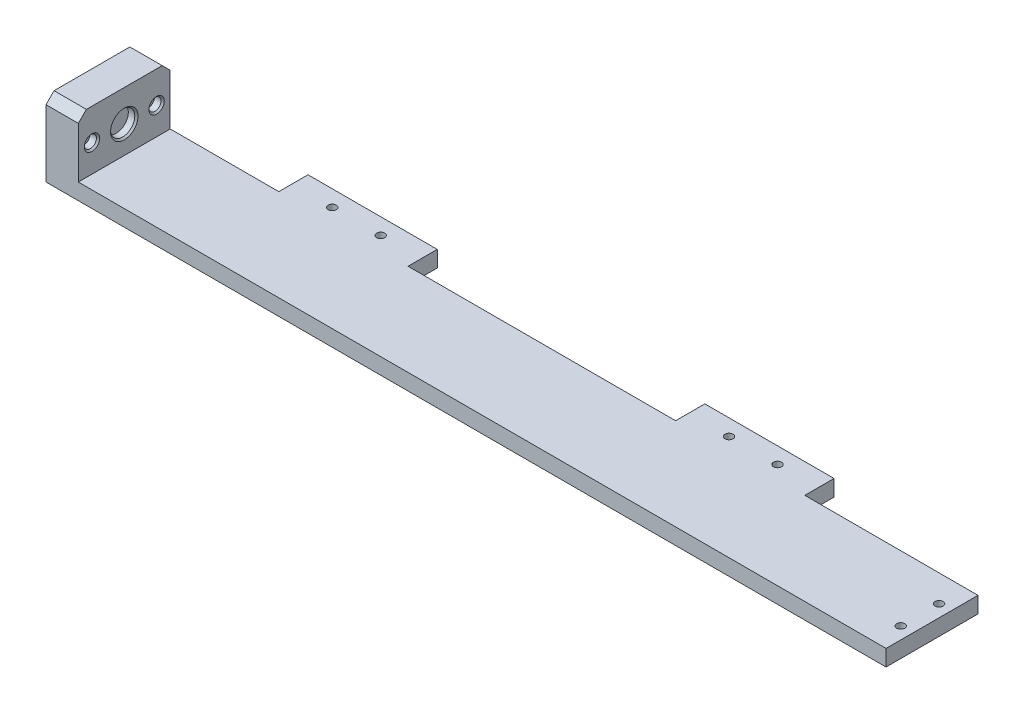
ISO-10303-21;
HEADER;
FILE_DESCRIPTION(('STEP AP214'),'2;1');
FILE_NAME('part.step','',(''),(''),'','','');
FILE_SCHEMA(('AUTOMOTIVE_DESIGN { 1 0 10303 214 1 1 1 1 }'));
ENDSEC;
DATA;
#1=APPLICATION_CONTEXT('core data for automotive mechanical design processes');
#2=APPLICATION_PROTOCOL_DEFINITION('international standard','automotive_design',2000,#1);
#3=PRODUCT_CONTEXT('',#1,'mechanical');
#4=PRODUCT('Part','Part','',(#3));
#5=PRODUCT_RELATED_PRODUCT_CATEGORY('part','',(#4));
#6=PRODUCT_DEFINITION_FORMATION('','',#4);
#7=PRODUCT_DEFINITION_CONTEXT('part definition',#1,'design');
#8=PRODUCT_DEFINITION('design','',#6,#7);
#9=PRODUCT_DEFINITION_SHAPE('','',#8);
#10=(LENGTH_UNIT() NAMED_UNIT(*) SI_UNIT(.MILLI.,.METRE.));
#11=(NAMED_UNIT(*) PLANE_ANGLE_UNIT() SI_UNIT($,.RADIAN.));
#12=(NAMED_UNIT(*) SI_UNIT($,.STERADIAN.) SOLID_ANGLE_UNIT());
#13=UNCERTAINTY_MEASURE_WITH_UNIT(LENGTH_MEASURE(1.E-05),#10,'distance_accuracy_value','');
#14=(GEOMETRIC_REPRESENTATION_CONTEXT(3) GLOBAL_UNCERTAINTY_ASSIGNED_CONTEXT((#13)) GLOBAL_UNIT_ASSIGNED_CONTEXT((#10,
#11,#12)) REPRESENTATION_CONTEXT('',''));
#15=CARTESIAN_POINT('',(0.,0.,0.));
#16=DIRECTION('',(0.,0.,1.));
#17=DIRECTION('',(1.,0.,0.));
#18=AXIS2_PLACEMENT_3D('',#15,#16,#17);
#19=CARTESIAN_POINT('',(0.,20.,0.));
#20=DIRECTION('',(0.,1.,0.));
#21=DIRECTION('',(0.,0.,1.));
#22=AXIS2_PLACEMENT_3D('',#19,#20,#21);
#23=PLANE('',#22);
#24=CARTESIAN_POINT('',(-275.625,20.,-73.0910485052595));
#25=DIRECTION('',(0.,1.,0.));
#26=DIRECTION('',(0.,0.,1.));
#27=AXIS2_PLACEMENT_3D('',#24,#25,#26);
#28=CIRCLE('',#27,4.99999999999999);
#29=CARTESIAN_POINT('',(-275.625,20.,-68.0910485052595));
#30=VERTEX_POINT('',#29);
#31=EDGE_CURVE('E317',#30,#30,#28,.T.);
#32=ORIENTED_EDGE('',*,*,#31,.F.);
#33=EDGE_LOOP('',(#32));
#34=FACE_BOUND('',#33,.T.);
#35=CARTESIAN_POINT('',(-215.625,20.,-73.0910485052595));
#36=DIRECTION('',(0.,1.,0.));
#37=DIRECTION('',(0.,0.,1.));
#38=AXIS2_PLACEMENT_3D('',#35,#36,#37);
#39=CIRCLE('',#38,4.99999999999999);
#40=CARTESIAN_POINT('',(-215.625,20.,-68.0910485052595));
#41=VERTEX_POINT('',#40);
#42=EDGE_CURVE('E512',#41,#41,#39,.T.);
#43=ORIENTED_EDGE('',*,*,#42,.F.);
#44=EDGE_LOOP('',(#43));
#45=FACE_BOUND('',#44,.T.);
#46=CARTESIAN_POINT('',(215.625,20.,-73.0910485052595));
#47=DIRECTION('',(0.,1.,0.));
#48=DIRECTION('',(0.,0.,1.));
#49=AXIS2_PLACEMENT_3D('',#46,#47,#48);
#50=CIRCLE('',#49,4.99999999999999);
#51=CARTESIAN_POINT('',(215.625,20.,-68.0910485052595));
#52=VERTEX_POINT('',#51);
#53=EDGE_CURVE('E515',#52,#52,#50,.T.);
#54=ORIENTED_EDGE('',*,*,#53,.F.);
#55=EDGE_LOOP('',(#54));
#56=FACE_BOUND('',#55,.T.);
#57=CARTESIAN_POINT('',(275.625,20.,-73.0910485052595));
#58=DIRECTION('',(0.,1.,0.));
#59=DIRECTION('',(0.,0.,1.));
#60=AXIS2_PLACEMENT_3D('',#57,#58,#59);
#61=CIRCLE('',#60,4.99999999999999);
#62=CARTESIAN_POINT('',(275.625,20.,-68.0910485052595));
#63=VERTEX_POINT('',#62);
#64=EDGE_CURVE('E519',#63,#63,#61,.T.);
#65=ORIENTED_EDGE('',*,*,#64,.F.);
#66=EDGE_LOOP('',(#65));
#67=FACE_BOUND('',#66,.T.);
#68=CARTESIAN_POINT('',(525.,20.,-23.7500000000004));
#69=DIRECTION('',(0.,1.,0.));
#70=DIRECTION('',(0.,0.,1.));
#71=AXIS2_PLACEMENT_3D('',#68,#69,#70);
#72=CIRCLE('',#71,5.00000000000005);
#73=CARTESIAN_POINT('',(525.,20.,-18.7500000000003));
#74=VERTEX_POINT('',#73);
#75=EDGE_CURVE('E188',#74,#74,#72,.T.);
#76=ORIENTED_EDGE('',*,*,#75,.F.);
#77=EDGE_LOOP('',(#76));
#78=FACE_BOUND('',#77,.T.);
#79=CARTESIAN_POINT('',(525.,20.,23.7499999999996));
#80=DIRECTION('',(0.,1.,0.));
#81=DIRECTION('',(0.,0.,1.));
#82=AXIS2_PLACEMENT_3D('',#79,#80,#81);
#83=CIRCLE('',#82,5.00000000000004);
#84=CARTESIAN_POINT('',(525.,20.,28.7499999999997));
#85=VERTEX_POINT('',#84);
#86=EDGE_CURVE('E191',#85,#85,#83,.T.);
#87=ORIENTED_EDGE('',*,*,#86,.F.);
#88=EDGE_LOOP('',(#87));
#89=FACE_BOUND('',#88,.T.);
#90=DIRECTION('',(-1.,0.,0.));
#91=VECTOR('',#90,1.);
#92=CARTESIAN_POINT('',(500.,20.,-56.9089514947405));
#93=LINE('',#92,#91);
#94=CARTESIAN_POINT('',(-325.625,20.,-56.9089514947405));
#95=VERTEX_POINT('',#94);
#96=CARTESIAN_POINT('',(-460.,20.,-56.9089514947405));
#97=VERTEX_POINT('',#96);
#98=EDGE_CURVE('E277',#95,#97,#93,.T.);
#99=ORIENTED_EDGE('',*,*,#98,.T.);
#100=DIRECTION('',(0.,0.,1.));
#101=VECTOR('',#100,1.);
#102=CARTESIAN_POINT('',(-460.,20.,-140.088677724249));
#103=LINE('',#102,#101);
#104=CARTESIAN_POINT('',(-460.,20.,56.9089514947405));
#105=VERTEX_POINT('',#104);
#106=EDGE_CURVE('E208',#97,#105,#103,.T.);
#107=ORIENTED_EDGE('',*,*,#106,.T.);
#108=DIRECTION('',(1.,0.,0.));
#109=VECTOR('',#108,1.);
#110=CARTESIAN_POINT('',(500.,20.,56.9089514947405));
#111=LINE('',#110,#109);
#112=CARTESIAN_POINT('',(540.,20.,56.9089514947405));
#113=VERTEX_POINT('',#112);
#114=EDGE_CURVE('E265',#105,#113,#111,.T.);
#115=ORIENTED_EDGE('',*,*,#114,.T.);
#116=DIRECTION('',(0.,0.,1.));
#117=VECTOR('',#116,1.);
#118=CARTESIAN_POINT('',(540.,20.,56.9089514947405));
#119=LINE('',#118,#117);
#120=CARTESIAN_POINT('',(540.,20.,-56.9089514947405));
#121=VERTEX_POINT('',#120);
#122=EDGE_CURVE('E187',#121,#113,#119,.T.);
#123=ORIENTED_EDGE('',*,*,#122,.F.);
#124=CARTESIAN_POINT('',(325.625,20.,-56.9089514947405));
#125=VERTEX_POINT('',#124);
#126=EDGE_CURVE('E272',#121,#125,#93,.T.);
#127=ORIENTED_EDGE('',*,*,#126,.T.);
#128=DIRECTION('',(0.,0.,-1.));
#129=VECTOR('',#128,1.);
#130=CARTESIAN_POINT('',(325.625,20.,-93.0910485052595));
#131=LINE('',#130,#129);
#132=CARTESIAN_POINT('',(325.625,20.,-93.0910485052595));
#133=VERTEX_POINT('',#132);
#134=EDGE_CURVE('E232',#125,#133,#131,.T.);
#135=ORIENTED_EDGE('',*,*,#134,.T.);
#136=DIRECTION('',(-1.,0.,0.));
#137=VECTOR('',#136,1.);
#138=CARTESIAN_POINT('',(165.625,20.,-93.0910485052595));
#139=LINE('',#138,#137);
#140=CARTESIAN_POINT('',(165.625,20.,-93.0910485052595));
#141=VERTEX_POINT('',#140);
#142=EDGE_CURVE('E223',#133,#141,#139,.T.);
#143=ORIENTED_EDGE('',*,*,#142,.T.);
#144=DIRECTION('',(0.,0.,1.));
#145=VECTOR('',#144,1.);
#146=CARTESIAN_POINT('',(165.625,20.,-93.0910485052595));
#147=LINE('',#146,#145);
#148=CARTESIAN_POINT('',(165.625,20.,-56.9089514947405));
#149=VERTEX_POINT('',#148);
#150=EDGE_CURVE('E215',#141,#149,#147,.T.);
#151=ORIENTED_EDGE('',*,*,#150,.T.);
#152=CARTESIAN_POINT('',(-165.625,20.,-56.9089514947405));
#153=VERTEX_POINT('',#152);
#154=EDGE_CURVE('E280',#149,#153,#93,.T.);
#155=ORIENTED_EDGE('',*,*,#154,.T.);
#156=DIRECTION('',(0.,0.,-1.));
#157=VECTOR('',#156,1.);
#158=CARTESIAN_POINT('',(-165.625,20.,-93.0910485052595));
#159=LINE('',#158,#157);
#160=CARTESIAN_POINT('',(-165.625,20.,-93.0910485052595));
#161=VERTEX_POINT('',#160);
#162=EDGE_CURVE('E258',#153,#161,#159,.T.);
#163=ORIENTED_EDGE('',*,*,#162,.T.);
#164=DIRECTION('',(-1.,0.,0.));
#165=VECTOR('',#164,1.);
#166=CARTESIAN_POINT('',(-325.625,20.,-93.0910485052595));
#167=LINE('',#166,#165);
#168=CARTESIAN_POINT('',(-325.625,20.,-93.0910485052595));
#169=VERTEX_POINT('',#168);
#170=EDGE_CURVE('E249',#161,#169,#167,.T.);
#171=ORIENTED_EDGE('',*,*,#170,.T.);
#172=DIRECTION('',(0.,0.,1.));
#173=VECTOR('',#172,1.);
#174=CARTESIAN_POINT('',(-325.625,20.,-93.0910485052595));
#175=LINE('',#174,#173);
#176=EDGE_CURVE('E239',#169,#95,#175,.T.);
#177=ORIENTED_EDGE('',*,*,#176,.T.);
#178=EDGE_LOOP('',(#99,#107,#115,#123,#127,#135,#143,#151,#155,#163,#171,#177));
#179=FACE_BOUND('',#178,.T.);
#180=ADVANCED_FACE('F41',(#34,#45,#56,#67,#78,#89,#179),#23,.T.);
#181=CARTESIAN_POINT('',(500.,0.,-56.9089514947405));
#182=DIRECTION('',(0.,0.,-1.));
#183=DIRECTION('',(-1.,0.,0.));
#184=AXIS2_PLACEMENT_3D('',#181,#182,#183);
#185=PLANE('',#184);
#186=DIRECTION('',(0.,1.,0.));
#187=VECTOR('',#186,1.);
#188=CARTESIAN_POINT('',(165.625,0.,-56.9089514947405));
#189=LINE('',#188,#187);
#190=CARTESIAN_POINT('',(165.625,0.,-56.9089514947405));
#191=VERTEX_POINT('',#190);
#192=EDGE_CURVE('E229',#191,#149,#189,.T.);
#193=ORIENTED_EDGE('',*,*,#192,.F.);
#194=DIRECTION('',(-1.,0.,0.));
#195=VECTOR('',#194,1.);
#196=CARTESIAN_POINT('',(500.,0.,-56.9089514947405));
#197=LINE('',#196,#195);
#198=CARTESIAN_POINT('',(-165.625,0.,-56.9089514947405));
#199=VERTEX_POINT('',#198);
#200=EDGE_CURVE('E275',#191,#199,#197,.T.);
#201=ORIENTED_EDGE('',*,*,#200,.T.);
#202=DIRECTION('',(0.,1.,0.));
#203=VECTOR('',#202,1.);
#204=CARTESIAN_POINT('',(-165.625,0.,-56.9089514947405));
#205=LINE('',#204,#203);
#206=EDGE_CURVE('E268',#199,#153,#205,.T.);
#207=ORIENTED_EDGE('',*,*,#206,.T.);
#208=ORIENTED_EDGE('',*,*,#154,.F.);
#209=EDGE_LOOP('',(#193,#201,#207,#208));
#210=FACE_BOUND('',#209,.T.);
#211=ADVANCED_FACE('F343',(#210),#185,.T.);
#212=DIRECTION('',(0.,1.,0.));
#213=VECTOR('',#212,1.);
#214=CARTESIAN_POINT('',(325.625,0.,-56.9089514947405));
#215=LINE('',#214,#213);
#216=CARTESIAN_POINT('',(325.625,0.,-56.9089514947405));
#217=VERTEX_POINT('',#216);
#218=EDGE_CURVE('E242',#217,#125,#215,.T.);
#219=ORIENTED_EDGE('',*,*,#218,.T.);
#220=ORIENTED_EDGE('',*,*,#126,.F.);
#221=DIRECTION('',(0.,1.,0.));
#222=VECTOR('',#221,1.);
#223=CARTESIAN_POINT('',(540.,20.,-56.9089514947405));
#224=LINE('',#223,#222);
#225=CARTESIAN_POINT('',(540.,0.,-56.9089514947405));
#226=VERTEX_POINT('',#225);
#227=EDGE_CURVE('E182',#226,#121,#224,.T.);
#228=ORIENTED_EDGE('',*,*,#227,.F.);
#229=EDGE_CURVE('E178',#226,#217,#197,.T.);
#230=ORIENTED_EDGE('',*,*,#229,.T.);
#231=EDGE_LOOP('',(#219,#220,#228,#230));
#232=FACE_BOUND('',#231,.T.);
#233=ADVANCED_FACE('F411',(#232),#185,.T.);
#234=CARTESIAN_POINT('',(-500.,0.,-56.9089514947405));
#235=DIRECTION('',(-1.,0.,0.));
#236=DIRECTION('',(0.,0.,1.));
#237=AXIS2_PLACEMENT_3D('',#234,#235,#236);
#238=PLANE('',#237);
#239=DIRECTION('',(0.,0.,1.));
#240=VECTOR('',#239,1.);
#241=CARTESIAN_POINT('',(-500.,92.9305618764593,-140.088677724249));
#242=LINE('',#241,#240);
#243=CARTESIAN_POINT('',(-500.,92.9305618764593,-46.9089514947405));
#244=VERTEX_POINT('',#243);
#245=CARTESIAN_POINT('',(-500.,92.9305618764593,46.9089514947403));
#246=VERTEX_POINT('',#245);
#247=EDGE_CURVE('E212',#244,#246,#242,.T.);
#248=ORIENTED_EDGE('',*,*,#247,.F.);
#249=DIRECTION('',(0.,0.707106781186551,0.707106781186544));
#250=VECTOR('',#249,1.);
#251=CARTESIAN_POINT('',(-500.,41.4652809382291,-98.3742324329701));
#252=LINE('',#251,#250);
#253=CARTESIAN_POINT('',(-500.,82.9305618764592,-56.9089514947405));
#254=VERTEX_POINT('',#253);
#255=EDGE_CURVE('E291',#244,#254,#252,.F.);
#256=ORIENTED_EDGE('',*,*,#255,.T.);
#257=DIRECTION('',(0.,1.,0.));
#258=VECTOR('',#257,1.);
#259=CARTESIAN_POINT('',(-500.,0.,-56.9089514947405));
#260=LINE('',#259,#258);
#261=CARTESIAN_POINT('',(-500.,0.,-56.9089514947405));
#262=VERTEX_POINT('',#261);
#263=EDGE_CURVE('E281',#262,#254,#260,.T.);
#264=ORIENTED_EDGE('',*,*,#263,.F.);
#265=DIRECTION('',(0.,0.,1.));
#266=VECTOR('',#265,1.);
#267=CARTESIAN_POINT('',(-500.,0.,-56.9089514947405));
#268=LINE('',#267,#266);
#269=CARTESIAN_POINT('',(-500.,0.,56.9089514947405));
#270=VERTEX_POINT('',#269);
#271=EDGE_CURVE('E172',#262,#270,#268,.T.);
#272=ORIENTED_EDGE('',*,*,#271,.T.);
#273=DIRECTION('',(0.,1.,0.));
#274=VECTOR('',#273,1.);
#275=CARTESIAN_POINT('',(-500.,0.,56.9089514947405));
#276=LINE('',#275,#274);
#277=CARTESIAN_POINT('',(-500.,82.9305618764592,56.9089514947405));
#278=VERTEX_POINT('',#277);
#279=EDGE_CURVE('E167',#270,#278,#276,.T.);
#280=ORIENTED_EDGE('',*,*,#279,.T.);
#281=DIRECTION('',(0.,-0.707106781186544,0.707106781186551));
#282=VECTOR('',#281,1.);
#283=CARTESIAN_POINT('',(-500.,98.3742324329705,41.465280938229));
#284=LINE('',#283,#282);
#285=EDGE_CURVE('E289',#278,#246,#284,.F.);
#286=ORIENTED_EDGE('',*,*,#285,.T.);
#287=EDGE_LOOP('',(#248,#256,#264,#272,#280,#286));
#288=FACE_BOUND('',#287,.T.);
#289=ADVANCED_FACE('F367',(#288),#238,.T.);
#290=ORIENTED_EDGE('',*,*,#263,.T.);
#291=DIRECTION('',(1.,0.,0.));
#292=VECTOR('',#291,1.);
#293=CARTESIAN_POINT('',(500.,82.9305618764592,-56.9089514947405));
#294=LINE('',#293,#292);
#295=CARTESIAN_POINT('',(-460.,82.9305618764592,-56.9089514947405));
#296=VERTEX_POINT('',#295);
#297=EDGE_CURVE('E67',#254,#296,#294,.T.);
#298=ORIENTED_EDGE('',*,*,#297,.T.);
#299=DIRECTION('',(0.,1.,0.));
#300=VECTOR('',#299,1.);
#301=CARTESIAN_POINT('',(-460.,20.,-56.9089514947405));
#302=LINE('',#301,#300);
#303=EDGE_CURVE('E209',#97,#296,#302,.T.);
#304=ORIENTED_EDGE('',*,*,#303,.F.);
#305=ORIENTED_EDGE('',*,*,#98,.F.);
#306=DIRECTION('',(0.,1.,0.));
#307=VECTOR('',#306,1.);
#308=CARTESIAN_POINT('',(-325.625,0.,-56.9089514947405));
#309=LINE('',#308,#307);
#310=CARTESIAN_POINT('',(-325.625,0.,-56.9089514947405));
#311=VERTEX_POINT('',#310);
#312=EDGE_CURVE('E255',#311,#95,#309,.T.);
#313=ORIENTED_EDGE('',*,*,#312,.F.);
#314=EDGE_CURVE('E171',#311,#262,#197,.T.);
#315=ORIENTED_EDGE('',*,*,#314,.T.);
#316=EDGE_LOOP('',(#290,#298,#304,#305,#313,#315));
#317=FACE_BOUND('',#316,.T.);
#318=ADVANCED_FACE('F363',(#317),#185,.T.);
#319=CARTESIAN_POINT('',(500.,0.,56.9089514947405));
#320=DIRECTION('',(0.,0.,1.));
#321=DIRECTION('',(1.,0.,0.));
#322=AXIS2_PLACEMENT_3D('',#319,#320,#321);
#323=PLANE('',#322);
#324=DIRECTION('',(0.,1.,0.));
#325=VECTOR('',#324,1.);
#326=CARTESIAN_POINT('',(-460.,20.,56.9089514947405));
#327=LINE('',#326,#325);
#328=CARTESIAN_POINT('',(-460.,82.9305618764592,56.9089514947405));
#329=VERTEX_POINT('',#328);
#330=EDGE_CURVE('E206',#105,#329,#327,.T.);
#331=ORIENTED_EDGE('',*,*,#330,.T.);
#332=DIRECTION('',(-1.,0.,0.));
#333=VECTOR('',#332,1.);
#334=CARTESIAN_POINT('',(500.,82.9305618764592,56.9089514947405));
#335=LINE('',#334,#333);
#336=EDGE_CURVE('E297',#329,#278,#335,.T.);
#337=ORIENTED_EDGE('',*,*,#336,.T.);
#338=ORIENTED_EDGE('',*,*,#279,.F.);
#339=DIRECTION('',(1.,0.,0.));
#340=VECTOR('',#339,1.);
#341=CARTESIAN_POINT('',(500.,0.,56.9089514947405));
#342=LINE('',#341,#340);
#343=CARTESIAN_POINT('',(540.,0.,56.9089514947405));
#344=VERTEX_POINT('',#343);
#345=EDGE_CURVE('E159',#270,#344,#342,.T.);
#346=ORIENTED_EDGE('',*,*,#345,.T.);
#347=DIRECTION('',(0.,-1.,0.));
#348=VECTOR('',#347,1.);
#349=CARTESIAN_POINT('',(540.,20.,56.9089514947405));
#350=LINE('',#349,#348);
#351=EDGE_CURVE('E164',#113,#344,#350,.T.);
#352=ORIENTED_EDGE('',*,*,#351,.F.);
#353=ORIENTED_EDGE('',*,*,#114,.F.);
#354=EDGE_LOOP('',(#331,#337,#338,#346,#352,#353));
#355=FACE_BOUND('',#354,.T.);
#356=ADVANCED_FACE('F161',(#355),#323,.T.);
#357=CARTESIAN_POINT('',(0.,0.,0.));
#358=DIRECTION('',(0.,1.,0.));
#359=DIRECTION('',(0.,0.,1.));
#360=AXIS2_PLACEMENT_3D('',#357,#358,#359);
#361=PLANE('',#360);
#362=CARTESIAN_POINT('',(-275.625,0.,-73.0910485052595));
#363=DIRECTION('',(0.,1.,0.));
#364=DIRECTION('',(0.,0.,1.));
#365=AXIS2_PLACEMENT_3D('',#362,#363,#364);
#366=CIRCLE('',#365,4.99999999999999);
#367=CARTESIAN_POINT('',(-275.625,0.,-68.0910485052595));
#368=VERTEX_POINT('',#367);
#369=EDGE_CURVE('E46',#368,#368,#366,.T.);
#370=ORIENTED_EDGE('',*,*,#369,.T.);
#371=EDGE_LOOP('',(#370));
#372=FACE_BOUND('',#371,.T.);
#373=CARTESIAN_POINT('',(-215.625,0.,-73.0910485052595));
#374=DIRECTION('',(0.,1.,0.));
#375=DIRECTION('',(0.,0.,1.));
#376=AXIS2_PLACEMENT_3D('',#373,#374,#375);
#377=CIRCLE('',#376,4.99999999999999);
#378=CARTESIAN_POINT('',(-215.625,0.,-68.0910485052595));
#379=VERTEX_POINT('',#378);
#380=EDGE_CURVE('E319',#379,#379,#377,.T.);
#381=ORIENTED_EDGE('',*,*,#380,.T.);
#382=EDGE_LOOP('',(#381));
#383=FACE_BOUND('',#382,.T.);
#384=CARTESIAN_POINT('',(215.625,0.,-73.0910485052595));
#385=DIRECTION('',(0.,1.,0.));
#386=DIRECTION('',(0.,0.,1.));
#387=AXIS2_PLACEMENT_3D('',#384,#385,#386);
#388=CIRCLE('',#387,4.99999999999999);
#389=CARTESIAN_POINT('',(215.625,0.,-68.0910485052595));
#390=VERTEX_POINT('',#389);
#391=EDGE_CURVE('E316',#390,#390,#388,.T.);
#392=ORIENTED_EDGE('',*,*,#391,.T.);
#393=EDGE_LOOP('',(#392));
#394=FACE_BOUND('',#393,.T.);
#395=CARTESIAN_POINT('',(275.625,0.,-73.0910485052595));
#396=DIRECTION('',(0.,1.,0.));
#397=DIRECTION('',(0.,0.,1.));
#398=AXIS2_PLACEMENT_3D('',#395,#396,#397);
#399=CIRCLE('',#398,4.99999999999999);
#400=CARTESIAN_POINT('',(275.625,0.,-68.0910485052595));
#401=VERTEX_POINT('',#400);
#402=EDGE_CURVE('E313',#401,#401,#399,.T.);
#403=ORIENTED_EDGE('',*,*,#402,.T.);
#404=EDGE_LOOP('',(#403));
#405=FACE_BOUND('',#404,.T.);
#406=CARTESIAN_POINT('',(525.,0.,-23.7500000000004));
#407=DIRECTION('',(0.,1.,0.));
#408=DIRECTION('',(0.,0.,1.));
#409=AXIS2_PLACEMENT_3D('',#406,#407,#408);
#410=CIRCLE('',#409,5.00000000000005);
#411=CARTESIAN_POINT('',(525.,0.,-18.7500000000003));
#412=VERTEX_POINT('',#411);
#413=EDGE_CURVE('E328',#412,#412,#410,.T.);
#414=ORIENTED_EDGE('',*,*,#413,.T.);
#415=EDGE_LOOP('',(#414));
#416=FACE_BOUND('',#415,.T.);
#417=CARTESIAN_POINT('',(525.,0.,23.7499999999996));
#418=DIRECTION('',(0.,1.,0.));
#419=DIRECTION('',(0.,0.,1.));
#420=AXIS2_PLACEMENT_3D('',#417,#418,#419);
#421=CIRCLE('',#420,5.00000000000004);
#422=CARTESIAN_POINT('',(525.,0.,28.7499999999997));
#423=VERTEX_POINT('',#422);
#424=EDGE_CURVE('E324',#423,#423,#421,.T.);
#425=ORIENTED_EDGE('',*,*,#424,.T.);
#426=EDGE_LOOP('',(#425));
#427=FACE_BOUND('',#426,.T.);
#428=ORIENTED_EDGE('',*,*,#271,.F.);
#429=ORIENTED_EDGE('',*,*,#314,.F.);
#430=DIRECTION('',(0.,0.,1.));
#431=VECTOR('',#430,1.);
#432=CARTESIAN_POINT('',(-325.625,0.,-93.0910485052595));
#433=LINE('',#432,#431);
#434=CARTESIAN_POINT('',(-325.625,0.,-93.0910485052595));
#435=VERTEX_POINT('',#434);
#436=EDGE_CURVE('E246',#435,#311,#433,.T.);
#437=ORIENTED_EDGE('',*,*,#436,.F.);
#438=DIRECTION('',(-1.,0.,0.));
#439=VECTOR('',#438,1.);
#440=CARTESIAN_POINT('',(-325.625,0.,-93.0910485052595));
#441=LINE('',#440,#439);
#442=CARTESIAN_POINT('',(-165.625,0.,-93.0910485052595));
#443=VERTEX_POINT('',#442);
#444=EDGE_CURVE('E252',#443,#435,#441,.T.);
#445=ORIENTED_EDGE('',*,*,#444,.F.);
#446=DIRECTION('',(0.,0.,-1.));
#447=VECTOR('',#446,1.);
#448=CARTESIAN_POINT('',(-165.625,0.,-93.0910485052595));
#449=LINE('',#448,#447);
#450=EDGE_CURVE('E248',#199,#443,#449,.T.);
#451=ORIENTED_EDGE('',*,*,#450,.F.);
#452=ORIENTED_EDGE('',*,*,#200,.F.);
#453=DIRECTION('',(0.,0.,1.));
#454=VECTOR('',#453,1.);
#455=CARTESIAN_POINT('',(165.625,0.,-93.0910485052595));
#456=LINE('',#455,#454);
#457=CARTESIAN_POINT('',(165.625,0.,-93.0910485052595));
#458=VERTEX_POINT('',#457);
#459=EDGE_CURVE('E219',#458,#191,#456,.T.);
#460=ORIENTED_EDGE('',*,*,#459,.F.);
#461=DIRECTION('',(-1.,0.,0.));
#462=VECTOR('',#461,1.);
#463=CARTESIAN_POINT('',(165.625,0.,-93.0910485052595));
#464=LINE('',#463,#462);
#465=CARTESIAN_POINT('',(325.625,0.,-93.0910485052595));
#466=VERTEX_POINT('',#465);
#467=EDGE_CURVE('E226',#466,#458,#464,.T.);
#468=ORIENTED_EDGE('',*,*,#467,.F.);
#469=DIRECTION('',(0.,0.,-1.));
#470=VECTOR('',#469,1.);
#471=CARTESIAN_POINT('',(325.625,0.,-93.0910485052595));
#472=LINE('',#471,#470);
#473=EDGE_CURVE('E222',#217,#466,#472,.T.);
#474=ORIENTED_EDGE('',*,*,#473,.F.);
#475=ORIENTED_EDGE('',*,*,#229,.F.);
#476=DIRECTION('',(0.,0.,-1.));
#477=VECTOR('',#476,1.);
#478=CARTESIAN_POINT('',(540.,0.,56.9089514947405));
#479=LINE('',#478,#477);
#480=EDGE_CURVE('E175',#344,#226,#479,.T.);
#481=ORIENTED_EDGE('',*,*,#480,.F.);
#482=ORIENTED_EDGE('',*,*,#345,.F.);
#483=EDGE_LOOP('',(#428,#429,#437,#445,#451,#452,#460,#468,#474,#475,#481,#482));
#484=FACE_BOUND('',#483,.T.);
#485=ADVANCED_FACE('F176',(#372,#383,#394,#405,#416,#427,#484),#361,.F.);
#486=CARTESIAN_POINT('',(-325.625,0.,-93.0910485052595));
#487=DIRECTION('',(-1.,0.,0.));
#488=DIRECTION('',(0.,0.,1.));
#489=AXIS2_PLACEMENT_3D('',#486,#487,#488);
#490=PLANE('',#489);
#491=ORIENTED_EDGE('',*,*,#176,.F.);
#492=DIRECTION('',(0.,1.,0.));
#493=VECTOR('',#492,1.);
#494=CARTESIAN_POINT('',(-325.625,0.,-93.0910485052595));
#495=LINE('',#494,#493);
#496=EDGE_CURVE('E263',#435,#169,#495,.T.);
#497=ORIENTED_EDGE('',*,*,#496,.F.);
#498=ORIENTED_EDGE('',*,*,#436,.T.);
#499=ORIENTED_EDGE('',*,*,#312,.T.);
#500=EDGE_LOOP('',(#491,#497,#498,#499));
#501=FACE_BOUND('',#500,.T.);
#502=ADVANCED_FACE('F403',(#501),#490,.T.);
#503=CARTESIAN_POINT('',(-325.625,0.,-93.0910485052595));
#504=DIRECTION('',(0.,0.,-1.));
#505=DIRECTION('',(-1.,0.,0.));
#506=AXIS2_PLACEMENT_3D('',#503,#504,#505);
#507=PLANE('',#506);
#508=ORIENTED_EDGE('',*,*,#170,.F.);
#509=DIRECTION('',(0.,1.,0.));
#510=VECTOR('',#509,1.);
#511=CARTESIAN_POINT('',(-165.625,0.,-93.0910485052595));
#512=LINE('',#511,#510);
#513=EDGE_CURVE('E266',#443,#161,#512,.T.);
#514=ORIENTED_EDGE('',*,*,#513,.F.);
#515=ORIENTED_EDGE('',*,*,#444,.T.);
#516=ORIENTED_EDGE('',*,*,#496,.T.);
#517=EDGE_LOOP('',(#508,#514,#515,#516));
#518=FACE_BOUND('',#517,.T.);
#519=ADVANCED_FACE('F398',(#518),#507,.T.);
#520=CARTESIAN_POINT('',(-165.625,0.,-93.0910485052595));
#521=DIRECTION('',(1.,0.,0.));
#522=DIRECTION('',(0.,0.,-1.));
#523=AXIS2_PLACEMENT_3D('',#520,#521,#522);
#524=PLANE('',#523);
#525=ORIENTED_EDGE('',*,*,#162,.F.);
#526=ORIENTED_EDGE('',*,*,#206,.F.);
#527=ORIENTED_EDGE('',*,*,#450,.T.);
#528=ORIENTED_EDGE('',*,*,#513,.T.);
#529=EDGE_LOOP('',(#525,#526,#527,#528));
#530=FACE_BOUND('',#529,.T.);
#531=ADVANCED_FACE('F358',(#530),#524,.T.);
#532=CARTESIAN_POINT('',(165.625,0.,-93.0910485052595));
#533=DIRECTION('',(-1.,0.,0.));
#534=DIRECTION('',(0.,0.,1.));
#535=AXIS2_PLACEMENT_3D('',#532,#533,#534);
#536=PLANE('',#535);
#537=ORIENTED_EDGE('',*,*,#150,.F.);
#538=DIRECTION('',(0.,1.,0.));
#539=VECTOR('',#538,1.);
#540=CARTESIAN_POINT('',(165.625,0.,-93.0910485052595));
#541=LINE('',#540,#539);
#542=EDGE_CURVE('E237',#458,#141,#541,.T.);
#543=ORIENTED_EDGE('',*,*,#542,.F.);
#544=ORIENTED_EDGE('',*,*,#459,.T.);
#545=ORIENTED_EDGE('',*,*,#192,.T.);
#546=EDGE_LOOP('',(#537,#543,#544,#545));
#547=FACE_BOUND('',#546,.T.);
#548=ADVANCED_FACE('F390',(#547),#536,.T.);
#549=CARTESIAN_POINT('',(165.625,0.,-93.0910485052595));
#550=DIRECTION('',(0.,0.,-1.));
#551=DIRECTION('',(-1.,0.,0.));
#552=AXIS2_PLACEMENT_3D('',#549,#550,#551);
#553=PLANE('',#552);
#554=ORIENTED_EDGE('',*,*,#142,.F.);
#555=DIRECTION('',(0.,1.,0.));
#556=VECTOR('',#555,1.);
#557=CARTESIAN_POINT('',(325.625,0.,-93.0910485052595));
#558=LINE('',#557,#556);
#559=EDGE_CURVE('E240',#466,#133,#558,.T.);
#560=ORIENTED_EDGE('',*,*,#559,.F.);
#561=ORIENTED_EDGE('',*,*,#467,.T.);
#562=ORIENTED_EDGE('',*,*,#542,.T.);
#563=EDGE_LOOP('',(#554,#560,#561,#562));
#564=FACE_BOUND('',#563,.T.);
#565=ADVANCED_FACE('F388',(#564),#553,.T.);
#566=CARTESIAN_POINT('',(325.625,0.,-93.0910485052595));
#567=DIRECTION('',(1.,0.,0.));
#568=DIRECTION('',(0.,0.,-1.));
#569=AXIS2_PLACEMENT_3D('',#566,#567,#568);
#570=PLANE('',#569);
#571=ORIENTED_EDGE('',*,*,#134,.F.);
#572=ORIENTED_EDGE('',*,*,#218,.F.);
#573=ORIENTED_EDGE('',*,*,#473,.T.);
#574=ORIENTED_EDGE('',*,*,#559,.T.);
#575=EDGE_LOOP('',(#571,#572,#573,#574));
#576=FACE_BOUND('',#575,.T.);
#577=ADVANCED_FACE('F385',(#576),#570,.T.);
#578=CARTESIAN_POINT('',(-460.,20.,-140.088677724249));
#579=DIRECTION('',(1.,0.,0.));
#580=DIRECTION('',(0.,0.,-1.));
#581=AXIS2_PLACEMENT_3D('',#578,#579,#580);
#582=PLANE('',#581);
#583=CARTESIAN_POINT('',(-460.,53.8253093136275,40.));
#584=DIRECTION('',(1.,0.,0.));
#585=DIRECTION('',(0.,0.,-1.));
#586=AXIS2_PLACEMENT_3D('',#583,#584,#585);
#587=CIRCLE('',#586,9.49999999999984);
#588=CARTESIAN_POINT('',(-460.,53.8253093136275,30.5000000000002));
#589=VERTEX_POINT('',#588);
#590=EDGE_CURVE('E305',#589,#589,#587,.F.);
#591=ORIENTED_EDGE('',*,*,#590,.T.);
#592=EDGE_LOOP('',(#591));
#593=FACE_BOUND('',#592,.T.);
#594=CARTESIAN_POINT('',(-460.,53.8253093136275,0.));
#595=DIRECTION('',(1.,0.,0.));
#596=DIRECTION('',(0.,0.,-1.));
#597=AXIS2_PLACEMENT_3D('',#594,#595,#596);
#598=CIRCLE('',#597,16.9999999999999);
#599=CARTESIAN_POINT('',(-460.,53.8253093136275,-16.9999999999999));
#600=VERTEX_POINT('',#599);
#601=EDGE_CURVE('E302',#600,#600,#598,.F.);
#602=ORIENTED_EDGE('',*,*,#601,.T.);
#603=EDGE_LOOP('',(#602));
#604=FACE_BOUND('',#603,.T.);
#605=CARTESIAN_POINT('',(-460.,53.8253093136275,-40.));
#606=DIRECTION('',(1.,0.,0.));
#607=DIRECTION('',(0.,0.,-1.));
#608=AXIS2_PLACEMENT_3D('',#605,#606,#607);
#609=CIRCLE('',#608,9.49999999999984);
#610=CARTESIAN_POINT('',(-460.,53.8253093136275,-49.4999999999998));
#611=VERTEX_POINT('',#610);
#612=EDGE_CURVE('E299',#611,#611,#609,.F.);
#613=ORIENTED_EDGE('',*,*,#612,.T.);
#614=EDGE_LOOP('',(#613));
#615=FACE_BOUND('',#614,.T.);
#616=ORIENTED_EDGE('',*,*,#303,.T.);
#617=DIRECTION('',(0.,-0.707106781186551,-0.707106781186544));
#618=VECTOR('',#617,1.);
#619=CARTESIAN_POINT('',(-460.,9.87541782347477,-129.964095547724));
#620=LINE('',#619,#618);
#621=CARTESIAN_POINT('',(-460.,92.9305618764593,-46.9089514947405));
#622=VERTEX_POINT('',#621);
#623=EDGE_CURVE('E295',#296,#622,#620,.F.);
#624=ORIENTED_EDGE('',*,*,#623,.T.);
#625=DIRECTION('',(0.,0.,1.));
#626=VECTOR('',#625,1.);
#627=CARTESIAN_POINT('',(-460.,92.9305618764593,-140.088677724249));
#628=LINE('',#627,#626);
#629=CARTESIAN_POINT('',(-460.,92.9305618764593,46.9089514947403));
#630=VERTEX_POINT('',#629);
#631=EDGE_CURVE('E211',#622,#630,#628,.T.);
#632=ORIENTED_EDGE('',*,*,#631,.T.);
#633=DIRECTION('',(0.,0.707106781186544,-0.707106781186551));
#634=VECTOR('',#633,1.);
#635=CARTESIAN_POINT('',(-460.,149.964095547725,-10.1245821765258));
#636=LINE('',#635,#634);
#637=EDGE_CURVE('E59',#630,#329,#636,.F.);
#638=ORIENTED_EDGE('',*,*,#637,.T.);
#639=ORIENTED_EDGE('',*,*,#330,.F.);
#640=ORIENTED_EDGE('',*,*,#106,.F.);
#641=EDGE_LOOP('',(#616,#624,#632,#638,#639,#640));
#642=FACE_BOUND('',#641,.T.);
#643=ADVANCED_FACE('F376',(#593,#604,#615,#642),#582,.T.);
#644=CARTESIAN_POINT('',(-500.,92.9305618764593,-140.088677724249));
#645=DIRECTION('',(0.,1.,0.));
#646=DIRECTION('',(0.,0.,1.));
#647=AXIS2_PLACEMENT_3D('',#644,#645,#646);
#648=PLANE('',#647);
#649=ORIENTED_EDGE('',*,*,#631,.F.);
#650=DIRECTION('',(-1.,0.,0.));
#651=VECTOR('',#650,1.);
#652=CARTESIAN_POINT('',(-500.,92.9305618764593,-46.9089514947405));
#653=LINE('',#652,#651);
#654=EDGE_CURVE('E286',#622,#244,#653,.T.);
#655=ORIENTED_EDGE('',*,*,#654,.T.);
#656=ORIENTED_EDGE('',*,*,#247,.T.);
#657=DIRECTION('',(1.,0.,0.));
#658=VECTOR('',#657,1.);
#659=CARTESIAN_POINT('',(-500.,92.9305618764593,46.9089514947403));
#660=LINE('',#659,#658);
#661=EDGE_CURVE('E283',#246,#630,#660,.T.);
#662=ORIENTED_EDGE('',*,*,#661,.T.);
#663=EDGE_LOOP('',(#649,#655,#656,#662));
#664=FACE_BOUND('',#663,.T.);
#665=ADVANCED_FACE('F374',(#664),#648,.T.);
#666=CARTESIAN_POINT('',(500.,53.8253093136275,0.));
#667=DIRECTION('',(-1.,0.,0.));
#668=DIRECTION('',(0.,0.,1.));
#669=AXIS2_PLACEMENT_3D('',#666,#667,#668);
#670=CYLINDRICAL_SURFACE('',#669,15.);
#671=CARTESIAN_POINT('',(-462.,53.8253093136275,0.));
#672=DIRECTION('',(1.,0.,0.));
#673=DIRECTION('',(0.,0.,-1.));
#674=AXIS2_PLACEMENT_3D('',#671,#672,#673);
#675=CIRCLE('',#674,15.);
#676=CARTESIAN_POINT('',(-462.,53.8253093136275,-15.));
#677=VERTEX_POINT('',#676);
#678=EDGE_CURVE('E51',#677,#677,#675,.T.);
#679=ORIENTED_EDGE('',*,*,#678,.T.);
#680=EDGE_LOOP('',(#679));
#681=FACE_BOUND('',#680,.T.);
#682=CARTESIAN_POINT('',(-470.,53.8253093136275,0.));
#683=DIRECTION('',(1.,0.,0.));
#684=DIRECTION('',(0.,0.,-1.));
#685=AXIS2_PLACEMENT_3D('',#682,#683,#684);
#686=CIRCLE('',#685,15.);
#687=CARTESIAN_POINT('',(-470.,53.8253093136275,-15.));
#688=VERTEX_POINT('',#687);
#689=EDGE_CURVE('E201',#688,#688,#686,.T.);
#690=ORIENTED_EDGE('',*,*,#689,.F.);
#691=EDGE_LOOP('',(#690));
#692=FACE_BOUND('',#691,.T.);
#693=ADVANCED_FACE('F460',(#681,#692),#670,.F.);
#694=CARTESIAN_POINT('',(-470.,53.8253093136275,0.));
#695=DIRECTION('',(1.,0.,0.));
#696=DIRECTION('',(0.,0.,-1.));
#697=AXIS2_PLACEMENT_3D('',#694,#695,#696);
#698=PLANE('',#697);
#699=ORIENTED_EDGE('',*,*,#689,.T.);
#700=EDGE_LOOP('',(#699));
#701=FACE_BOUND('',#700,.T.);
#702=ADVANCED_FACE('F465',(#701),#698,.T.);
#703=CARTESIAN_POINT('',(500.,53.8253093136275,-40.));
#704=DIRECTION('',(-1.,0.,0.));
#705=DIRECTION('',(0.,0.,1.));
#706=AXIS2_PLACEMENT_3D('',#703,#704,#705);
#707=CYLINDRICAL_SURFACE('',#706,7.5);
#708=CARTESIAN_POINT('',(-462.,53.8253093136275,-40.));
#709=DIRECTION('',(1.,0.,0.));
#710=DIRECTION('',(0.,0.,-1.));
#711=AXIS2_PLACEMENT_3D('',#708,#709,#710);
#712=CIRCLE('',#711,7.5);
#713=CARTESIAN_POINT('',(-462.,53.8253093136275,-47.5));
#714=VERTEX_POINT('',#713);
#715=EDGE_CURVE('E11',#714,#714,#712,.T.);
#716=ORIENTED_EDGE('',*,*,#715,.T.);
#717=EDGE_LOOP('',(#716));
#718=FACE_BOUND('',#717,.T.);
#719=CARTESIAN_POINT('',(-470.,53.8253093136275,-40.));
#720=DIRECTION('',(1.,0.,0.));
#721=DIRECTION('',(0.,0.,-1.));
#722=AXIS2_PLACEMENT_3D('',#719,#720,#721);
#723=CIRCLE('',#722,7.5);
#724=CARTESIAN_POINT('',(-470.,53.8253093136275,-47.5));
#725=VERTEX_POINT('',#724);
#726=EDGE_CURVE('E198',#725,#725,#723,.T.);
#727=ORIENTED_EDGE('',*,*,#726,.F.);
#728=EDGE_LOOP('',(#727));
#729=FACE_BOUND('',#728,.T.);
#730=ADVANCED_FACE('F469',(#718,#729),#707,.F.);
#731=CARTESIAN_POINT('',(-470.,53.8253093136275,-40.));
#732=DIRECTION('',(1.,0.,0.));
#733=DIRECTION('',(0.,0.,-1.));
#734=AXIS2_PLACEMENT_3D('',#731,#732,#733);
#735=PLANE('',#734);
#736=ORIENTED_EDGE('',*,*,#726,.T.);
#737=EDGE_LOOP('',(#736));
#738=FACE_BOUND('',#737,.T.);
#739=ADVANCED_FACE('F478',(#738),#735,.T.);
#740=CARTESIAN_POINT('',(500.,53.8253093136275,40.));
#741=DIRECTION('',(-1.,0.,0.));
#742=DIRECTION('',(0.,0.,1.));
#743=AXIS2_PLACEMENT_3D('',#740,#741,#742);
#744=CYLINDRICAL_SURFACE('',#743,7.5);
#745=CARTESIAN_POINT('',(-462.,53.8253093136275,40.));
#746=DIRECTION('',(1.,0.,0.));
#747=DIRECTION('',(0.,0.,-1.));
#748=AXIS2_PLACEMENT_3D('',#745,#746,#747);
#749=CIRCLE('',#748,7.5);
#750=CARTESIAN_POINT('',(-462.,53.8253093136275,32.5));
#751=VERTEX_POINT('',#750);
#752=EDGE_CURVE('E308',#751,#751,#749,.T.);
#753=ORIENTED_EDGE('',*,*,#752,.T.);
#754=EDGE_LOOP('',(#753));
#755=FACE_BOUND('',#754,.T.);
#756=CARTESIAN_POINT('',(-470.,53.8253093136275,40.));
#757=DIRECTION('',(1.,0.,0.));
#758=DIRECTION('',(0.,0.,-1.));
#759=AXIS2_PLACEMENT_3D('',#756,#757,#758);
#760=CIRCLE('',#759,7.5);
#761=CARTESIAN_POINT('',(-470.,53.8253093136275,32.5));
#762=VERTEX_POINT('',#761);
#763=EDGE_CURVE('E197',#762,#762,#760,.T.);
#764=ORIENTED_EDGE('',*,*,#763,.F.);
#765=EDGE_LOOP('',(#764));
#766=FACE_BOUND('',#765,.T.);
#767=ADVANCED_FACE('F474',(#755,#766),#744,.F.);
#768=CARTESIAN_POINT('',(-470.,53.8253093136275,40.));
#769=DIRECTION('',(1.,0.,0.));
#770=DIRECTION('',(0.,0.,-1.));
#771=AXIS2_PLACEMENT_3D('',#768,#769,#770);
#772=PLANE('',#771);
#773=ORIENTED_EDGE('',*,*,#763,.T.);
#774=EDGE_LOOP('',(#773));
#775=FACE_BOUND('',#774,.T.);
#776=ADVANCED_FACE('F471',(#775),#772,.T.);
#777=CARTESIAN_POINT('',(540.,0.,0.));
#778=DIRECTION('',(1.,0.,0.));
#779=DIRECTION('',(0.,0.,-1.));
#780=AXIS2_PLACEMENT_3D('',#777,#778,#779);
#781=PLANE('',#780);
#782=ORIENTED_EDGE('',*,*,#351,.T.);
#783=ORIENTED_EDGE('',*,*,#480,.T.);
#784=ORIENTED_EDGE('',*,*,#227,.T.);
#785=ORIENTED_EDGE('',*,*,#122,.T.);
#786=EDGE_LOOP('',(#782,#783,#784,#785));
#787=FACE_BOUND('',#786,.T.);
#788=ADVANCED_FACE('F185',(#787),#781,.T.);
#789=CARTESIAN_POINT('',(525.,0.,23.7499999999996));
#790=DIRECTION('',(0.,1.,0.));
#791=DIRECTION('',(0.,0.,1.));
#792=AXIS2_PLACEMENT_3D('',#789,#790,#791);
#793=CYLINDRICAL_SURFACE('',#792,5.00000000000004);
#794=ORIENTED_EDGE('',*,*,#86,.T.);
#795=EDGE_LOOP('',(#794));
#796=FACE_BOUND('',#795,.T.);
#797=ORIENTED_EDGE('',*,*,#424,.F.);
#798=EDGE_LOOP('',(#797));
#799=FACE_BOUND('',#798,.T.);
#800=ADVANCED_FACE('F338',(#796,#799),#793,.F.);
#801=CARTESIAN_POINT('',(525.,0.,-23.7500000000004));
#802=DIRECTION('',(0.,1.,0.));
#803=DIRECTION('',(0.,0.,1.));
#804=AXIS2_PLACEMENT_3D('',#801,#802,#803);
#805=CYLINDRICAL_SURFACE('',#804,5.00000000000005);
#806=ORIENTED_EDGE('',*,*,#75,.T.);
#807=EDGE_LOOP('',(#806));
#808=FACE_BOUND('',#807,.T.);
#809=ORIENTED_EDGE('',*,*,#413,.F.);
#810=EDGE_LOOP('',(#809));
#811=FACE_BOUND('',#810,.T.);
#812=ADVANCED_FACE('F424',(#808,#811),#805,.F.);
#813=CARTESIAN_POINT('',(-500.,92.9305618764593,-46.9089514947405));
#814=DIRECTION('',(0.,-0.707106781186544,0.707106781186551));
#815=DIRECTION('',(-1.,0.,0.));
#816=AXIS2_PLACEMENT_3D('',#813,#814,#815);
#817=PLANE('',#816);
#818=ORIENTED_EDGE('',*,*,#623,.F.);
#819=ORIENTED_EDGE('',*,*,#297,.F.);
#820=ORIENTED_EDGE('',*,*,#255,.F.);
#821=ORIENTED_EDGE('',*,*,#654,.F.);
#822=EDGE_LOOP('',(#818,#819,#820,#821));
#823=FACE_BOUND('',#822,.T.);
#824=ADVANCED_FACE('F371',(#823),#817,.F.);
#825=CARTESIAN_POINT('',(500.,82.9305618764592,56.9089514947405));
#826=DIRECTION('',(0.,-0.707106781186551,-0.707106781186544));
#827=DIRECTION('',(-1.,0.,0.));
#828=AXIS2_PLACEMENT_3D('',#825,#826,#827);
#829=PLANE('',#828);
#830=ORIENTED_EDGE('',*,*,#637,.F.);
#831=ORIENTED_EDGE('',*,*,#661,.F.);
#832=ORIENTED_EDGE('',*,*,#285,.F.);
#833=ORIENTED_EDGE('',*,*,#336,.F.);
#834=EDGE_LOOP('',(#830,#831,#832,#833));
#835=FACE_BOUND('',#834,.T.);
#836=ADVANCED_FACE('F379',(#835),#829,.F.);
#837=CARTESIAN_POINT('',(-460.,53.8253093136275,40.));
#838=DIRECTION('',(1.,0.,0.));
#839=DIRECTION('',(0.,0.,-1.));
#840=AXIS2_PLACEMENT_3D('',#837,#838,#839);
#841=CONICAL_SURFACE('',#840,9.49999999999984,0.785398163397409);
#842=ORIENTED_EDGE('',*,*,#752,.F.);
#843=EDGE_LOOP('',(#842));
#844=FACE_BOUND('',#843,.T.);
#845=ORIENTED_EDGE('',*,*,#590,.F.);
#846=EDGE_LOOP('',(#845));
#847=FACE_BOUND('',#846,.T.);
#848=ADVANCED_FACE('F430',(#844,#847),#841,.F.);
#849=CARTESIAN_POINT('',(-460.,53.8253093136275,0.));
#850=DIRECTION('',(1.,0.,0.));
#851=DIRECTION('',(0.,0.,-1.));
#852=AXIS2_PLACEMENT_3D('',#849,#850,#851);
#853=CONICAL_SURFACE('',#852,16.9999999999999,0.785398163397424);
#854=ORIENTED_EDGE('',*,*,#678,.F.);
#855=EDGE_LOOP('',(#854));
#856=FACE_BOUND('',#855,.T.);
#857=ORIENTED_EDGE('',*,*,#601,.F.);
#858=EDGE_LOOP('',(#857));
#859=FACE_BOUND('',#858,.T.);
#860=ADVANCED_FACE('F435',(#856,#859),#853,.F.);
#861=CARTESIAN_POINT('',(-460.,53.8253093136275,-40.));
#862=DIRECTION('',(1.,0.,0.));
#863=DIRECTION('',(0.,0.,-1.));
#864=AXIS2_PLACEMENT_3D('',#861,#862,#863);
#865=CONICAL_SURFACE('',#864,9.49999999999984,0.785398163397409);
#866=ORIENTED_EDGE('',*,*,#715,.F.);
#867=EDGE_LOOP('',(#866));
#868=FACE_BOUND('',#867,.T.);
#869=ORIENTED_EDGE('',*,*,#612,.F.);
#870=EDGE_LOOP('',(#869));
#871=FACE_BOUND('',#870,.T.);
#872=ADVANCED_FACE('F44',(#868,#871),#865,.F.);
#873=CARTESIAN_POINT('',(275.625,-280.,-73.0910485052595));
#874=DIRECTION('',(0.,1.,0.));
#875=DIRECTION('',(0.,0.,1.));
#876=AXIS2_PLACEMENT_3D('',#873,#874,#875);
#877=CYLINDRICAL_SURFACE('',#876,4.99999999999999);
#878=ORIENTED_EDGE('',*,*,#64,.T.);
#879=EDGE_LOOP('',(#878));
#880=FACE_BOUND('',#879,.T.);
#881=ORIENTED_EDGE('',*,*,#402,.F.);
#882=EDGE_LOOP('',(#881));
#883=FACE_BOUND('',#882,.T.);
#884=ADVANCED_FACE('F444',(#880,#883),#877,.F.);
#885=CARTESIAN_POINT('',(215.625,-280.,-73.0910485052595));
#886=DIRECTION('',(0.,1.,0.));
#887=DIRECTION('',(0.,0.,1.));
#888=AXIS2_PLACEMENT_3D('',#885,#886,#887);
#889=CYLINDRICAL_SURFACE('',#888,4.99999999999999);
#890=ORIENTED_EDGE('',*,*,#53,.T.);
#891=EDGE_LOOP('',(#890));
#892=FACE_BOUND('',#891,.T.);
#893=ORIENTED_EDGE('',*,*,#391,.F.);
#894=EDGE_LOOP('',(#893));
#895=FACE_BOUND('',#894,.T.);
#896=ADVANCED_FACE('F495',(#892,#895),#889,.F.);
#897=CARTESIAN_POINT('',(-215.625,-280.,-73.0910485052595));
#898=DIRECTION('',(0.,1.,0.));
#899=DIRECTION('',(0.,0.,1.));
#900=AXIS2_PLACEMENT_3D('',#897,#898,#899);
#901=CYLINDRICAL_SURFACE('',#900,4.99999999999999);
#902=ORIENTED_EDGE('',*,*,#42,.T.);
#903=EDGE_LOOP('',(#902));
#904=FACE_BOUND('',#903,.T.);
#905=ORIENTED_EDGE('',*,*,#380,.F.);
#906=EDGE_LOOP('',(#905));
#907=FACE_BOUND('',#906,.T.);
#908=ADVANCED_FACE('F499',(#904,#907),#901,.F.);
#909=CARTESIAN_POINT('',(-275.625,-280.,-73.0910485052595));
#910=DIRECTION('',(0.,1.,0.));
#911=DIRECTION('',(0.,0.,1.));
#912=AXIS2_PLACEMENT_3D('',#909,#910,#911);
#913=CYLINDRICAL_SURFACE('',#912,4.99999999999999);
#914=ORIENTED_EDGE('',*,*,#31,.T.);
#915=EDGE_LOOP('',(#914));
#916=FACE_BOUND('',#915,.T.);
#917=ORIENTED_EDGE('',*,*,#369,.F.);
#918=EDGE_LOOP('',(#917));
#919=FACE_BOUND('',#918,.T.);
#920=ADVANCED_FACE('F503',(#916,#919),#913,.F.);
#921=CLOSED_SHELL('',(#180,#211,#233,#289,#318,#356,#485,#502,#519,#531,#548,#565,#577,#643,
#665,#693,#702,#730,#739,#767,#776,#788,#800,#812,#824,#836,#848,#860,#872,#884,#896,#908,#920));
#922=MANIFOLD_SOLID_BREP('B2',#921);
#923=ADVANCED_BREP_SHAPE_REPRESENTATION('',(#18,#922),#14);
#924=SHAPE_DEFINITION_REPRESENTATION(#9,#923);
ENDSEC;
END-ISO-10303-21;
